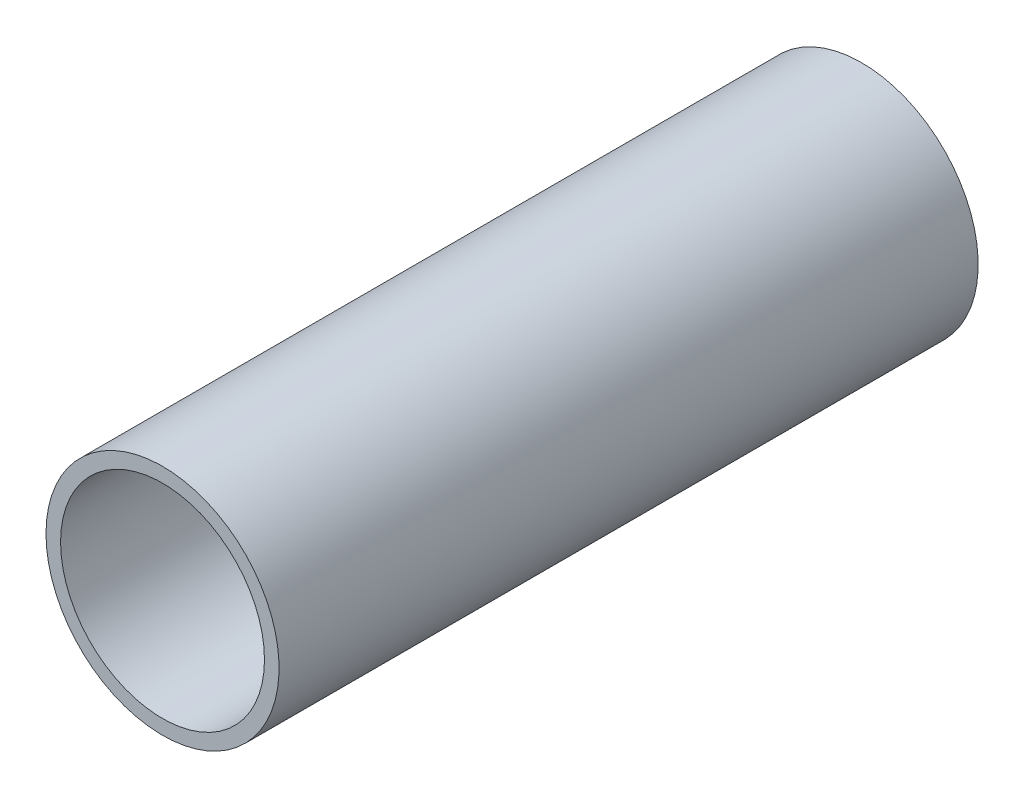
ISO-10303-21;
HEADER;
FILE_DESCRIPTION(('STEP AP214'),'2;1');
FILE_NAME('part.step','',(''),(''),'','','');
FILE_SCHEMA(('AUTOMOTIVE_DESIGN { 1 0 10303 214 1 1 1 1 }'));
ENDSEC;
DATA;
#1=APPLICATION_CONTEXT('core data for automotive mechanical design processes');
#2=APPLICATION_PROTOCOL_DEFINITION('international standard','automotive_design',2000,#1);
#3=PRODUCT_CONTEXT('',#1,'mechanical');
#4=PRODUCT('Part','Part','',(#3));
#5=PRODUCT_RELATED_PRODUCT_CATEGORY('part','',(#4));
#6=PRODUCT_DEFINITION_FORMATION('','',#4);
#7=PRODUCT_DEFINITION_CONTEXT('part definition',#1,'design');
#8=PRODUCT_DEFINITION('design','',#6,#7);
#9=PRODUCT_DEFINITION_SHAPE('','',#8);
#10=(LENGTH_UNIT() NAMED_UNIT(*) SI_UNIT(.MILLI.,.METRE.));
#11=(NAMED_UNIT(*) PLANE_ANGLE_UNIT() SI_UNIT($,.RADIAN.));
#12=(NAMED_UNIT(*) SI_UNIT($,.STERADIAN.) SOLID_ANGLE_UNIT());
#13=UNCERTAINTY_MEASURE_WITH_UNIT(LENGTH_MEASURE(1.E-05),#10,'distance_accuracy_value','');
#14=(GEOMETRIC_REPRESENTATION_CONTEXT(3) GLOBAL_UNCERTAINTY_ASSIGNED_CONTEXT((#13)) GLOBAL_UNIT_ASSIGNED_CONTEXT((#10,
#11,#12)) REPRESENTATION_CONTEXT('',''));
#15=CARTESIAN_POINT('',(0.,0.,0.));
#16=DIRECTION('',(0.,0.,1.));
#17=DIRECTION('',(1.,0.,0.));
#18=AXIS2_PLACEMENT_3D('',#15,#16,#17);
#19=CARTESIAN_POINT('',(0.,0.,152.4));
#20=DIRECTION('',(0.,0.,1.));
#21=DIRECTION('',(1.,0.,0.));
#22=AXIS2_PLACEMENT_3D('',#19,#20,#21);
#23=PLANE('',#22);
#24=CARTESIAN_POINT('',(0.,0.,152.4));
#25=DIRECTION('',(0.,0.,1.));
#26=DIRECTION('',(1.,0.,0.));
#27=AXIS2_PLACEMENT_3D('',#24,#25,#26);
#28=CIRCLE('',#27,50.8);
#29=CARTESIAN_POINT('',(-50.8,0.,152.4));
#30=VERTEX_POINT('',#29);
#31=EDGE_CURVE('E10',#30,#30,#28,.T.);
#32=ORIENTED_EDGE('',*,*,#31,.T.);
#33=EDGE_LOOP('',(#32));
#34=FACE_BOUND('',#33,.T.);
#35=CARTESIAN_POINT('',(0.,0.,152.4));
#36=DIRECTION('',(0.,0.,1.));
#37=DIRECTION('',(1.,0.,0.));
#38=AXIS2_PLACEMENT_3D('',#35,#36,#37);
#39=CIRCLE('',#38,44.45);
#40=CARTESIAN_POINT('',(-44.45,0.,152.4));
#41=VERTEX_POINT('',#40);
#42=EDGE_CURVE('E41',#41,#41,#39,.T.);
#43=ORIENTED_EDGE('',*,*,#42,.F.);
#44=EDGE_LOOP('',(#43));
#45=FACE_BOUND('',#44,.T.);
#46=ADVANCED_FACE('F30',(#34,#45),#23,.T.);
#47=CARTESIAN_POINT('',(0.,0.,-152.4));
#48=DIRECTION('',(0.,0.,1.));
#49=DIRECTION('',(1.,0.,0.));
#50=AXIS2_PLACEMENT_3D('',#47,#48,#49);
#51=PLANE('',#50);
#52=CARTESIAN_POINT('',(0.,0.,-152.4));
#53=DIRECTION('',(0.,0.,1.));
#54=DIRECTION('',(1.,0.,0.));
#55=AXIS2_PLACEMENT_3D('',#52,#53,#54);
#56=CIRCLE('',#55,50.8);
#57=CARTESIAN_POINT('',(-50.8,0.,-152.4));
#58=VERTEX_POINT('',#57);
#59=EDGE_CURVE('E34',#58,#58,#56,.T.);
#60=ORIENTED_EDGE('',*,*,#59,.F.);
#61=EDGE_LOOP('',(#60));
#62=FACE_BOUND('',#61,.T.);
#63=CARTESIAN_POINT('',(0.,0.,-152.4));
#64=DIRECTION('',(0.,0.,1.));
#65=DIRECTION('',(1.,0.,0.));
#66=AXIS2_PLACEMENT_3D('',#63,#64,#65);
#67=CIRCLE('',#66,44.45);
#68=CARTESIAN_POINT('',(-44.45,0.,-152.4));
#69=VERTEX_POINT('',#68);
#70=EDGE_CURVE('E43',#69,#69,#67,.T.);
#71=ORIENTED_EDGE('',*,*,#70,.T.);
#72=EDGE_LOOP('',(#71));
#73=FACE_BOUND('',#72,.T.);
#74=ADVANCED_FACE('F53',(#62,#73),#51,.F.);
#75=CARTESIAN_POINT('',(0.,0.,152.4));
#76=DIRECTION('',(0.,0.,-1.));
#77=DIRECTION('',(-1.,0.,0.));
#78=AXIS2_PLACEMENT_3D('',#75,#76,#77);
#79=CYLINDRICAL_SURFACE('',#78,50.8);
#80=CARTESIAN_POINT('',(-50.8,0.,152.4));
#81=CARTESIAN_POINT('',(-50.8,0.,149.225));
#82=CARTESIAN_POINT('',(-50.8,0.,146.05));
#83=CARTESIAN_POINT('',(-50.8,0.,139.7));
#84=CARTESIAN_POINT('',(-50.8,0.,136.525));
#85=CARTESIAN_POINT('',(-50.8,0.,130.175));
#86=CARTESIAN_POINT('',(-50.8,0.,127.));
#87=CARTESIAN_POINT('',(-50.8,0.,120.65));
#88=CARTESIAN_POINT('',(-50.8,0.,117.475));
#89=CARTESIAN_POINT('',(-50.8,0.,111.125));
#90=CARTESIAN_POINT('',(-50.8,0.,107.95));
#91=CARTESIAN_POINT('',(-50.8,0.,101.6));
#92=CARTESIAN_POINT('',(-50.8,0.,98.425));
#93=CARTESIAN_POINT('',(-50.8,0.,92.075));
#94=CARTESIAN_POINT('',(-50.8,0.,88.9));
#95=CARTESIAN_POINT('',(-50.8,0.,82.55));
#96=CARTESIAN_POINT('',(-50.8,0.,79.375));
#97=CARTESIAN_POINT('',(-50.8,0.,73.025));
#98=CARTESIAN_POINT('',(-50.8,0.,69.85));
#99=CARTESIAN_POINT('',(-50.8,0.,63.5));
#100=CARTESIAN_POINT('',(-50.8,0.,60.325));
#101=CARTESIAN_POINT('',(-50.8,0.,53.975));
#102=CARTESIAN_POINT('',(-50.8,0.,50.8));
#103=CARTESIAN_POINT('',(-50.8,0.,44.45));
#104=CARTESIAN_POINT('',(-50.8,0.,41.275));
#105=CARTESIAN_POINT('',(-50.8,0.,34.925));
#106=CARTESIAN_POINT('',(-50.8,0.,31.75));
#107=CARTESIAN_POINT('',(-50.8,0.,25.4));
#108=CARTESIAN_POINT('',(-50.8,0.,22.225));
#109=CARTESIAN_POINT('',(-50.8,0.,15.875));
#110=CARTESIAN_POINT('',(-50.8,0.,12.7));
#111=CARTESIAN_POINT('',(-50.8,0.,6.34999999999998));
#112=CARTESIAN_POINT('',(-50.8,0.,3.17499999999997));
#113=CARTESIAN_POINT('',(-50.8,0.,-3.17500000000003));
#114=CARTESIAN_POINT('',(-50.8,0.,-6.35000000000003));
#115=CARTESIAN_POINT('',(-50.8,0.,-12.7));
#116=CARTESIAN_POINT('',(-50.8,0.,-15.875));
#117=CARTESIAN_POINT('',(-50.8,0.,-22.225));
#118=CARTESIAN_POINT('',(-50.8,0.,-25.4));
#119=CARTESIAN_POINT('',(-50.8,0.,-31.75));
#120=CARTESIAN_POINT('',(-50.8,0.,-34.925));
#121=CARTESIAN_POINT('',(-50.8,0.,-41.275));
#122=CARTESIAN_POINT('',(-50.8,0.,-44.45));
#123=CARTESIAN_POINT('',(-50.8,0.,-50.8));
#124=CARTESIAN_POINT('',(-50.8,0.,-53.975));
#125=CARTESIAN_POINT('',(-50.8,0.,-60.325));
#126=CARTESIAN_POINT('',(-50.8,0.,-63.5));
#127=CARTESIAN_POINT('',(-50.8,0.,-69.85));
#128=CARTESIAN_POINT('',(-50.8,0.,-73.025));
#129=CARTESIAN_POINT('',(-50.8,0.,-79.375));
#130=CARTESIAN_POINT('',(-50.8,0.,-82.5500000000001));
#131=CARTESIAN_POINT('',(-50.8,0.,-88.9));
#132=CARTESIAN_POINT('',(-50.8,0.,-92.0750000000001));
#133=CARTESIAN_POINT('',(-50.8,0.,-98.425));
#134=CARTESIAN_POINT('',(-50.8,0.,-101.6));
#135=CARTESIAN_POINT('',(-50.8,0.,-107.95));
#136=CARTESIAN_POINT('',(-50.8,0.,-111.125));
#137=CARTESIAN_POINT('',(-50.8,0.,-117.475));
#138=CARTESIAN_POINT('',(-50.8,0.,-120.65));
#139=CARTESIAN_POINT('',(-50.8,0.,-127.));
#140=CARTESIAN_POINT('',(-50.8,0.,-130.175));
#141=CARTESIAN_POINT('',(-50.8,0.,-136.525));
#142=CARTESIAN_POINT('',(-50.8,0.,-139.7));
#143=CARTESIAN_POINT('',(-50.8,0.,-146.05));
#144=CARTESIAN_POINT('',(-50.8,0.,-149.225));
#145=CARTESIAN_POINT('',(-50.8,0.,-152.4));
#146=B_SPLINE_CURVE_WITH_KNOTS('',3,(#80,#81,#82,#83,#84,#85,#86,#87,#88,#89,#90,#91,#92,#93,
#94,#95,#96,#97,#98,#99,#100,#101,#102,#103,#104,#105,#106,#107,#108,#109,#110,#111,#112,#113,
#114,#115,#116,#117,#118,#119,#120,#121,#122,#123,#124,#125,#126,#127,#128,#129,#130,#131,#132,
#133,#134,#135,#136,#137,#138,#139,#140,#141,#142,#143,#144,#145),.UNSPECIFIED.,.F.,.F.,(4,2,2,
2,2,2,2,2,2,2,2,2,2,2,2,2,2,2,2,2,2,2,2,2,2,2,2,2,2,2,2,2,4),(0.,9.52499999999998,19.05,28.575,
38.1,47.625,57.15,66.675,76.2,85.725,95.25,104.775,114.3,123.825,133.35,142.875,152.4,161.925,
171.45,180.975,190.5,200.025,209.55,219.075,228.6,238.125,247.65,257.175,266.7,276.225,285.75,
295.275,304.8),.UNSPECIFIED.);
#147=EDGE_CURVE('BSEAM32',#30,#58,#146,.T.);
#148=ORIENTED_EDGE('',*,*,#31,.F.);
#149=ORIENTED_EDGE('',*,*,#59,.T.);
#150=ORIENTED_EDGE('',*,*,#147,.T.);
#151=ORIENTED_EDGE('',*,*,#147,.F.);
#152=EDGE_LOOP('',(#148,#150,#149,#151));
#153=FACE_BOUND('',#152,.T.);
#154=ADVANCED_FACE('F32',(#153),#79,.T.);
#155=CARTESIAN_POINT('',(0.,0.,152.4));
#156=DIRECTION('',(0.,0.,-1.));
#157=DIRECTION('',(-1.,0.,0.));
#158=AXIS2_PLACEMENT_3D('',#155,#156,#157);
#159=CYLINDRICAL_SURFACE('',#158,44.45);
#160=CARTESIAN_POINT('',(-44.45,0.,152.4));
#161=CARTESIAN_POINT('',(-44.45,0.,149.225));
#162=CARTESIAN_POINT('',(-44.45,0.,146.05));
#163=CARTESIAN_POINT('',(-44.45,0.,139.7));
#164=CARTESIAN_POINT('',(-44.45,0.,136.525));
#165=CARTESIAN_POINT('',(-44.45,0.,130.175));
#166=CARTESIAN_POINT('',(-44.45,0.,127.));
#167=CARTESIAN_POINT('',(-44.45,0.,120.65));
#168=CARTESIAN_POINT('',(-44.45,0.,117.475));
#169=CARTESIAN_POINT('',(-44.45,0.,111.125));
#170=CARTESIAN_POINT('',(-44.45,0.,107.95));
#171=CARTESIAN_POINT('',(-44.45,0.,101.6));
#172=CARTESIAN_POINT('',(-44.45,0.,98.425));
#173=CARTESIAN_POINT('',(-44.45,0.,92.075));
#174=CARTESIAN_POINT('',(-44.45,0.,88.9));
#175=CARTESIAN_POINT('',(-44.45,0.,82.55));
#176=CARTESIAN_POINT('',(-44.45,0.,79.375));
#177=CARTESIAN_POINT('',(-44.45,0.,73.025));
#178=CARTESIAN_POINT('',(-44.45,0.,69.85));
#179=CARTESIAN_POINT('',(-44.45,0.,63.5));
#180=CARTESIAN_POINT('',(-44.45,0.,60.325));
#181=CARTESIAN_POINT('',(-44.45,0.,53.975));
#182=CARTESIAN_POINT('',(-44.45,0.,50.8));
#183=CARTESIAN_POINT('',(-44.45,0.,44.45));
#184=CARTESIAN_POINT('',(-44.45,0.,41.275));
#185=CARTESIAN_POINT('',(-44.45,0.,34.925));
#186=CARTESIAN_POINT('',(-44.45,0.,31.75));
#187=CARTESIAN_POINT('',(-44.45,0.,25.4));
#188=CARTESIAN_POINT('',(-44.45,0.,22.225));
#189=CARTESIAN_POINT('',(-44.45,0.,15.875));
#190=CARTESIAN_POINT('',(-44.45,0.,12.7));
#191=CARTESIAN_POINT('',(-44.45,0.,6.34999999999998));
#192=CARTESIAN_POINT('',(-44.45,0.,3.17499999999997));
#193=CARTESIAN_POINT('',(-44.45,0.,-3.17500000000003));
#194=CARTESIAN_POINT('',(-44.45,0.,-6.35000000000003));
#195=CARTESIAN_POINT('',(-44.45,0.,-12.7));
#196=CARTESIAN_POINT('',(-44.45,0.,-15.875));
#197=CARTESIAN_POINT('',(-44.45,0.,-22.225));
#198=CARTESIAN_POINT('',(-44.45,0.,-25.4));
#199=CARTESIAN_POINT('',(-44.45,0.,-31.75));
#200=CARTESIAN_POINT('',(-44.45,0.,-34.925));
#201=CARTESIAN_POINT('',(-44.45,0.,-41.275));
#202=CARTESIAN_POINT('',(-44.45,0.,-44.45));
#203=CARTESIAN_POINT('',(-44.45,0.,-50.8));
#204=CARTESIAN_POINT('',(-44.45,0.,-53.975));
#205=CARTESIAN_POINT('',(-44.45,0.,-60.325));
#206=CARTESIAN_POINT('',(-44.45,0.,-63.5));
#207=CARTESIAN_POINT('',(-44.45,0.,-69.85));
#208=CARTESIAN_POINT('',(-44.45,0.,-73.025));
#209=CARTESIAN_POINT('',(-44.45,0.,-79.375));
#210=CARTESIAN_POINT('',(-44.45,0.,-82.5500000000001));
#211=CARTESIAN_POINT('',(-44.45,0.,-88.9));
#212=CARTESIAN_POINT('',(-44.45,0.,-92.0750000000001));
#213=CARTESIAN_POINT('',(-44.45,0.,-98.425));
#214=CARTESIAN_POINT('',(-44.45,0.,-101.6));
#215=CARTESIAN_POINT('',(-44.45,0.,-107.95));
#216=CARTESIAN_POINT('',(-44.45,0.,-111.125));
#217=CARTESIAN_POINT('',(-44.45,0.,-117.475));
#218=CARTESIAN_POINT('',(-44.45,0.,-120.65));
#219=CARTESIAN_POINT('',(-44.45,0.,-127.));
#220=CARTESIAN_POINT('',(-44.45,0.,-130.175));
#221=CARTESIAN_POINT('',(-44.45,0.,-136.525));
#222=CARTESIAN_POINT('',(-44.45,0.,-139.7));
#223=CARTESIAN_POINT('',(-44.45,0.,-146.05));
#224=CARTESIAN_POINT('',(-44.45,0.,-149.225));
#225=CARTESIAN_POINT('',(-44.45,0.,-152.4));
#226=B_SPLINE_CURVE_WITH_KNOTS('',3,(#160,#161,#162,#163,#164,#165,#166,#167,#168,#169,#170,
#171,#172,#173,#174,#175,#176,#177,#178,#179,#180,#181,#182,#183,#184,#185,#186,#187,#188,#189,
#190,#191,#192,#193,#194,#195,#196,#197,#198,#199,#200,#201,#202,#203,#204,#205,#206,#207,#208,
#209,#210,#211,#212,#213,#214,#215,#216,#217,#218,#219,#220,#221,#222,#223,#224,#225),
.UNSPECIFIED.,.F.,.F.,(4,2,2,2,2,2,2,2,2,2,2,2,2,2,2,2,2,2,2,2,2,2,2,2,2,2,2,2,2,2,2,2,4),(0.,
9.52499999999998,19.05,28.575,38.1,47.625,57.15,66.675,76.2,85.725,95.25,104.775,114.3,123.825,
133.35,142.875,152.4,161.925,171.45,180.975,190.5,200.025,209.55,219.075,228.6,238.125,247.65,
257.175,266.7,276.225,285.75,295.275,304.8),.UNSPECIFIED.);
#227=EDGE_CURVE('BSEAM49',#41,#69,#226,.T.);
#228=ORIENTED_EDGE('',*,*,#42,.T.);
#229=ORIENTED_EDGE('',*,*,#70,.F.);
#230=ORIENTED_EDGE('',*,*,#227,.T.);
#231=ORIENTED_EDGE('',*,*,#227,.F.);
#232=EDGE_LOOP('',(#228,#230,#229,#231));
#233=FACE_BOUND('',#232,.T.);
#234=ADVANCED_FACE('F49',(#233),#159,.F.);
#235=CLOSED_SHELL('',(#46,#74,#154,#234));
#236=MANIFOLD_SOLID_BREP('B2',#235);
#237=ADVANCED_BREP_SHAPE_REPRESENTATION('',(#18,#236),#14);
#238=SHAPE_DEFINITION_REPRESENTATION(#9,#237);
ENDSEC;
END-ISO-10303-21;
